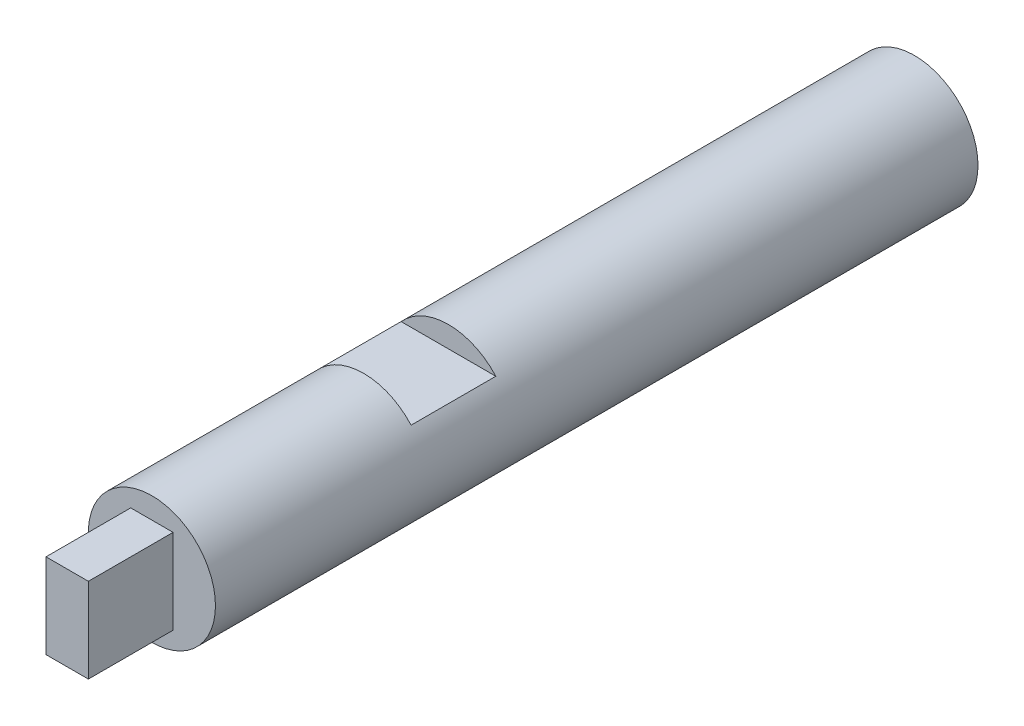
ISO-10303-21;
HEADER;
FILE_DESCRIPTION(('STEP AP214'),'2;1');
FILE_NAME('part.step','',(''),(''),'','','');
FILE_SCHEMA(('AUTOMOTIVE_DESIGN { 1 0 10303 214 1 1 1 1 }'));
ENDSEC;
DATA;
#1=APPLICATION_CONTEXT('core data for automotive mechanical design processes');
#2=APPLICATION_PROTOCOL_DEFINITION('international standard','automotive_design',2000,#1);
#3=PRODUCT_CONTEXT('',#1,'mechanical');
#4=PRODUCT('Part','Part','',(#3));
#5=PRODUCT_RELATED_PRODUCT_CATEGORY('part','',(#4));
#6=PRODUCT_DEFINITION_FORMATION('','',#4);
#7=PRODUCT_DEFINITION_CONTEXT('part definition',#1,'design');
#8=PRODUCT_DEFINITION('design','',#6,#7);
#9=PRODUCT_DEFINITION_SHAPE('','',#8);
#10=(LENGTH_UNIT() NAMED_UNIT(*) SI_UNIT(.MILLI.,.METRE.));
#11=(NAMED_UNIT(*) PLANE_ANGLE_UNIT() SI_UNIT($,.RADIAN.));
#12=(NAMED_UNIT(*) SI_UNIT($,.STERADIAN.) SOLID_ANGLE_UNIT());
#13=UNCERTAINTY_MEASURE_WITH_UNIT(LENGTH_MEASURE(1.E-05),#10,'distance_accuracy_value','');
#14=(GEOMETRIC_REPRESENTATION_CONTEXT(3) GLOBAL_UNCERTAINTY_ASSIGNED_CONTEXT((#13)) GLOBAL_UNIT_ASSIGNED_CONTEXT((#10,
#11,#12)) REPRESENTATION_CONTEXT('',''));
#15=CARTESIAN_POINT('',(0.,0.,0.));
#16=DIRECTION('',(0.,0.,1.));
#17=DIRECTION('',(1.,0.,0.));
#18=AXIS2_PLACEMENT_3D('',#15,#16,#17);
#19=CARTESIAN_POINT('',(-50.,6.,22.2426406871193));
#20=DIRECTION('',(0.,0.,-1.));
#21=DIRECTION('',(-1.,0.,0.));
#22=AXIS2_PLACEMENT_3D('',#19,#20,#21);
#23=CYLINDRICAL_SURFACE('',#22,1.5);
#24=DIRECTION('',(0.,0.,1.));
#25=VECTOR('',#24,1.);
#26=CARTESIAN_POINT('',(-51.1180339887499,7.,11.));
#27=LINE('',#26,#25);
#28=CARTESIAN_POINT('',(-51.1180339887499,7.,11.));
#29=VERTEX_POINT('',#28);
#30=CARTESIAN_POINT('',(-51.1180339887499,7.,13.));
#31=VERTEX_POINT('',#30);
#32=EDGE_CURVE('E98',#29,#31,#27,.T.);
#33=ORIENTED_EDGE('',*,*,#32,.F.);
#34=CARTESIAN_POINT('',(-50.,6.,11.));
#35=DIRECTION('',(0.,0.,-1.));
#36=DIRECTION('',(-1.,0.,0.));
#37=AXIS2_PLACEMENT_3D('',#34,#35,#36);
#38=CIRCLE('',#37,1.5);
#39=CARTESIAN_POINT('',(-48.8819660112501,7.,11.));
#40=VERTEX_POINT('',#39);
#41=EDGE_CURVE('E11',#29,#40,#38,.T.);
#42=ORIENTED_EDGE('',*,*,#41,.T.);
#43=DIRECTION('',(0.,0.,1.));
#44=VECTOR('',#43,1.);
#45=CARTESIAN_POINT('',(-48.8819660112501,7.,11.));
#46=LINE('',#45,#44);
#47=CARTESIAN_POINT('',(-48.8819660112501,7.,13.));
#48=VERTEX_POINT('',#47);
#49=EDGE_CURVE('E100',#40,#48,#46,.T.);
#50=ORIENTED_EDGE('',*,*,#49,.T.);
#51=CARTESIAN_POINT('',(-50.,6.,13.));
#52=DIRECTION('',(0.,0.,-1.));
#53=DIRECTION('',(-1.,0.,0.));
#54=AXIS2_PLACEMENT_3D('',#51,#52,#53);
#55=CIRCLE('',#54,1.5);
#56=EDGE_CURVE('E46',#31,#48,#55,.T.);
#57=ORIENTED_EDGE('',*,*,#56,.F.);
#58=EDGE_LOOP('',(#33,#42,#50,#57));
#59=FACE_BOUND('',#58,.T.);
#60=CARTESIAN_POINT('',(-50.,6.,0.));
#61=DIRECTION('',(0.,0.,1.));
#62=DIRECTION('',(1.,0.,0.));
#63=AXIS2_PLACEMENT_3D('',#60,#61,#62);
#64=CIRCLE('',#63,1.5);
#65=CARTESIAN_POINT('',(-48.5,6.,0.));
#66=VERTEX_POINT('',#65);
#67=EDGE_CURVE('E137',#66,#66,#64,.T.);
#68=ORIENTED_EDGE('',*,*,#67,.T.);
#69=EDGE_LOOP('',(#68));
#70=FACE_BOUND('',#69,.T.);
#71=CARTESIAN_POINT('',(-50.,6.,18.));
#72=DIRECTION('',(0.,0.,1.));
#73=DIRECTION('',(1.,0.,0.));
#74=AXIS2_PLACEMENT_3D('',#71,#72,#73);
#75=CIRCLE('',#74,1.5);
#76=CARTESIAN_POINT('',(-48.5,6.,18.));
#77=VERTEX_POINT('',#76);
#78=EDGE_CURVE('E140',#77,#77,#75,.T.);
#79=ORIENTED_EDGE('',*,*,#78,.F.);
#80=EDGE_LOOP('',(#79));
#81=FACE_BOUND('',#80,.T.);
#82=ADVANCED_FACE('F38',(#59,#70,#81),#23,.T.);
#83=CARTESIAN_POINT('',(-50.,6.,0.));
#84=DIRECTION('',(0.,0.,1.));
#85=DIRECTION('',(1.,0.,0.));
#86=AXIS2_PLACEMENT_3D('',#83,#84,#85);
#87=PLANE('',#86);
#88=ORIENTED_EDGE('',*,*,#67,.F.);
#89=EDGE_LOOP('',(#88));
#90=FACE_BOUND('',#89,.T.);
#91=ADVANCED_FACE('F153',(#90),#87,.F.);
#92=CARTESIAN_POINT('',(-50.,6.6,18.));
#93=DIRECTION('',(0.,0.,1.));
#94=DIRECTION('',(-1.,0.,0.));
#95=AXIS2_PLACEMENT_3D('',#92,#93,#94);
#96=PLANE('',#95);
#97=DIRECTION('',(0.,1.,0.));
#98=VECTOR('',#97,1.);
#99=CARTESIAN_POINT('',(-49.5,5.,18.));
#100=LINE('',#99,#98);
#101=CARTESIAN_POINT('',(-49.5,5.,18.));
#102=VERTEX_POINT('',#101);
#103=CARTESIAN_POINT('',(-49.5,7.,18.));
#104=VERTEX_POINT('',#103);
#105=EDGE_CURVE('E60',#102,#104,#100,.T.);
#106=ORIENTED_EDGE('',*,*,#105,.F.);
#107=DIRECTION('',(1.,0.,0.));
#108=VECTOR('',#107,1.);
#109=CARTESIAN_POINT('',(-50.5,5.,18.));
#110=LINE('',#109,#108);
#111=CARTESIAN_POINT('',(-50.5,5.,18.));
#112=VERTEX_POINT('',#111);
#113=EDGE_CURVE('E111',#112,#102,#110,.T.);
#114=ORIENTED_EDGE('',*,*,#113,.F.);
#115=DIRECTION('',(0.,-1.,0.));
#116=VECTOR('',#115,1.);
#117=CARTESIAN_POINT('',(-50.5,5.,18.));
#118=LINE('',#117,#116);
#119=CARTESIAN_POINT('',(-50.5,7.,18.));
#120=VERTEX_POINT('',#119);
#121=EDGE_CURVE('E122',#120,#112,#118,.T.);
#122=ORIENTED_EDGE('',*,*,#121,.F.);
#123=DIRECTION('',(-1.,0.,0.));
#124=VECTOR('',#123,1.);
#125=CARTESIAN_POINT('',(-50.5,7.,18.));
#126=LINE('',#125,#124);
#127=EDGE_CURVE('E119',#104,#120,#126,.T.);
#128=ORIENTED_EDGE('',*,*,#127,.F.);
#129=EDGE_LOOP('',(#106,#114,#122,#128));
#130=FACE_BOUND('',#129,.T.);
#131=ORIENTED_EDGE('',*,*,#78,.T.);
#132=EDGE_LOOP('',(#131));
#133=FACE_BOUND('',#132,.T.);
#134=ADVANCED_FACE('F40',(#130,#133),#96,.T.);
#135=CARTESIAN_POINT('',(-49.5,5.,20.));
#136=DIRECTION('',(-1.,0.,0.));
#137=DIRECTION('',(0.,0.,1.));
#138=AXIS2_PLACEMENT_3D('',#135,#136,#137);
#139=PLANE('',#138);
#140=ORIENTED_EDGE('',*,*,#105,.T.);
#141=DIRECTION('',(0.,0.,-1.));
#142=VECTOR('',#141,1.);
#143=CARTESIAN_POINT('',(-49.5,7.,20.));
#144=LINE('',#143,#142);
#145=CARTESIAN_POINT('',(-49.5,7.,20.));
#146=VERTEX_POINT('',#145);
#147=EDGE_CURVE('E134',#146,#104,#144,.T.);
#148=ORIENTED_EDGE('',*,*,#147,.F.);
#149=DIRECTION('',(0.,1.,0.));
#150=VECTOR('',#149,1.);
#151=CARTESIAN_POINT('',(-49.5,5.,20.));
#152=LINE('',#151,#150);
#153=CARTESIAN_POINT('',(-49.5,5.,20.));
#154=VERTEX_POINT('',#153);
#155=EDGE_CURVE('E107',#154,#146,#152,.T.);
#156=ORIENTED_EDGE('',*,*,#155,.F.);
#157=DIRECTION('',(0.,0.,-1.));
#158=VECTOR('',#157,1.);
#159=CARTESIAN_POINT('',(-49.5,5.,20.));
#160=LINE('',#159,#158);
#161=EDGE_CURVE('E117',#154,#102,#160,.T.);
#162=ORIENTED_EDGE('',*,*,#161,.T.);
#163=EDGE_LOOP('',(#140,#148,#156,#162));
#164=FACE_BOUND('',#163,.T.);
#165=ADVANCED_FACE('F160',(#164),#139,.F.);
#166=CARTESIAN_POINT('',(-50.5,7.,20.));
#167=DIRECTION('',(0.,-1.,0.));
#168=DIRECTION('',(0.,0.,-1.));
#169=AXIS2_PLACEMENT_3D('',#166,#167,#168);
#170=PLANE('',#169);
#171=ORIENTED_EDGE('',*,*,#127,.T.);
#172=DIRECTION('',(0.,0.,-1.));
#173=VECTOR('',#172,1.);
#174=CARTESIAN_POINT('',(-50.5,7.,20.));
#175=LINE('',#174,#173);
#176=CARTESIAN_POINT('',(-50.5,7.,20.));
#177=VERTEX_POINT('',#176);
#178=EDGE_CURVE('E131',#177,#120,#175,.T.);
#179=ORIENTED_EDGE('',*,*,#178,.F.);
#180=DIRECTION('',(-1.,0.,0.));
#181=VECTOR('',#180,1.);
#182=CARTESIAN_POINT('',(-50.5,7.,20.));
#183=LINE('',#182,#181);
#184=EDGE_CURVE('E110',#146,#177,#183,.T.);
#185=ORIENTED_EDGE('',*,*,#184,.F.);
#186=ORIENTED_EDGE('',*,*,#147,.T.);
#187=EDGE_LOOP('',(#171,#179,#185,#186));
#188=FACE_BOUND('',#187,.T.);
#189=ADVANCED_FACE('F163',(#188),#170,.F.);
#190=CARTESIAN_POINT('',(-50.5,5.,20.));
#191=DIRECTION('',(1.,0.,0.));
#192=DIRECTION('',(0.,0.,-1.));
#193=AXIS2_PLACEMENT_3D('',#190,#191,#192);
#194=PLANE('',#193);
#195=ORIENTED_EDGE('',*,*,#121,.T.);
#196=DIRECTION('',(0.,0.,-1.));
#197=VECTOR('',#196,1.);
#198=CARTESIAN_POINT('',(-50.5,5.,20.));
#199=LINE('',#198,#197);
#200=CARTESIAN_POINT('',(-50.5,5.,20.));
#201=VERTEX_POINT('',#200);
#202=EDGE_CURVE('E128',#201,#112,#199,.T.);
#203=ORIENTED_EDGE('',*,*,#202,.F.);
#204=DIRECTION('',(0.,-1.,0.));
#205=VECTOR('',#204,1.);
#206=CARTESIAN_POINT('',(-50.5,5.,20.));
#207=LINE('',#206,#205);
#208=EDGE_CURVE('E113',#177,#201,#207,.T.);
#209=ORIENTED_EDGE('',*,*,#208,.F.);
#210=ORIENTED_EDGE('',*,*,#178,.T.);
#211=EDGE_LOOP('',(#195,#203,#209,#210));
#212=FACE_BOUND('',#211,.T.);
#213=ADVANCED_FACE('F167',(#212),#194,.F.);
#214=CARTESIAN_POINT('',(-50.5,5.,20.));
#215=DIRECTION('',(0.,1.,0.));
#216=DIRECTION('',(0.,0.,1.));
#217=AXIS2_PLACEMENT_3D('',#214,#215,#216);
#218=PLANE('',#217);
#219=ORIENTED_EDGE('',*,*,#113,.T.);
#220=ORIENTED_EDGE('',*,*,#161,.F.);
#221=DIRECTION('',(1.,0.,0.));
#222=VECTOR('',#221,1.);
#223=CARTESIAN_POINT('',(-50.5,5.,20.));
#224=LINE('',#223,#222);
#225=EDGE_CURVE('E115',#201,#154,#224,.T.);
#226=ORIENTED_EDGE('',*,*,#225,.F.);
#227=ORIENTED_EDGE('',*,*,#202,.T.);
#228=EDGE_LOOP('',(#219,#220,#226,#227));
#229=FACE_BOUND('',#228,.T.);
#230=ADVANCED_FACE('F171',(#229),#218,.F.);
#231=CARTESIAN_POINT('',(0.,0.,20.));
#232=DIRECTION('',(0.,0.,-1.));
#233=DIRECTION('',(-1.,0.,0.));
#234=AXIS2_PLACEMENT_3D('',#231,#232,#233);
#235=PLANE('',#234);
#236=ORIENTED_EDGE('',*,*,#155,.T.);
#237=ORIENTED_EDGE('',*,*,#184,.T.);
#238=ORIENTED_EDGE('',*,*,#208,.T.);
#239=ORIENTED_EDGE('',*,*,#225,.T.);
#240=EDGE_LOOP('',(#236,#237,#238,#239));
#241=FACE_BOUND('',#240,.T.);
#242=ADVANCED_FACE('F150',(#241),#235,.F.);
#243=CARTESIAN_POINT('',(0.,0.,11.));
#244=DIRECTION('',(0.,0.,-1.));
#245=DIRECTION('',(-1.,0.,0.));
#246=AXIS2_PLACEMENT_3D('',#243,#244,#245);
#247=PLANE('',#246);
#248=DIRECTION('',(1.,0.,0.));
#249=VECTOR('',#248,1.);
#250=CARTESIAN_POINT('',(-48.8819660112501,7.,11.));
#251=LINE('',#250,#249);
#252=EDGE_CURVE('E92',#29,#40,#251,.T.);
#253=ORIENTED_EDGE('',*,*,#252,.T.);
#254=ORIENTED_EDGE('',*,*,#41,.F.);
#255=EDGE_LOOP('',(#253,#254));
#256=FACE_BOUND('',#255,.T.);
#257=ADVANCED_FACE('F91',(#256),#247,.F.);
#258=CARTESIAN_POINT('',(0.,0.,13.));
#259=DIRECTION('',(0.,0.,-1.));
#260=DIRECTION('',(-1.,0.,0.));
#261=AXIS2_PLACEMENT_3D('',#258,#259,#260);
#262=PLANE('',#261);
#263=ORIENTED_EDGE('',*,*,#56,.T.);
#264=DIRECTION('',(1.,0.,0.));
#265=VECTOR('',#264,1.);
#266=CARTESIAN_POINT('',(-48.8819660112501,7.,13.));
#267=LINE('',#266,#265);
#268=EDGE_CURVE('E52',#31,#48,#267,.T.);
#269=ORIENTED_EDGE('',*,*,#268,.F.);
#270=EDGE_LOOP('',(#263,#269));
#271=FACE_BOUND('',#270,.T.);
#272=ADVANCED_FACE('F142',(#271),#262,.T.);
#273=CARTESIAN_POINT('',(-48.8819660112501,7.,11.));
#274=DIRECTION('',(0.,-1.,0.));
#275=DIRECTION('',(0.,0.,-1.));
#276=AXIS2_PLACEMENT_3D('',#273,#274,#275);
#277=PLANE('',#276);
#278=ORIENTED_EDGE('',*,*,#268,.T.);
#279=ORIENTED_EDGE('',*,*,#49,.F.);
#280=ORIENTED_EDGE('',*,*,#252,.F.);
#281=ORIENTED_EDGE('',*,*,#32,.T.);
#282=EDGE_LOOP('',(#278,#279,#280,#281));
#283=FACE_BOUND('',#282,.T.);
#284=ADVANCED_FACE('F97',(#283),#277,.F.);
#285=CLOSED_SHELL('',(#82,#91,#134,#165,#189,#213,#230,#242,#257,#272,#284));
#286=MANIFOLD_SOLID_BREP('B2',#285);
#287=ADVANCED_BREP_SHAPE_REPRESENTATION('',(#18,#286),#14);
#288=SHAPE_DEFINITION_REPRESENTATION(#9,#287);
ENDSEC;
END-ISO-10303-21;
